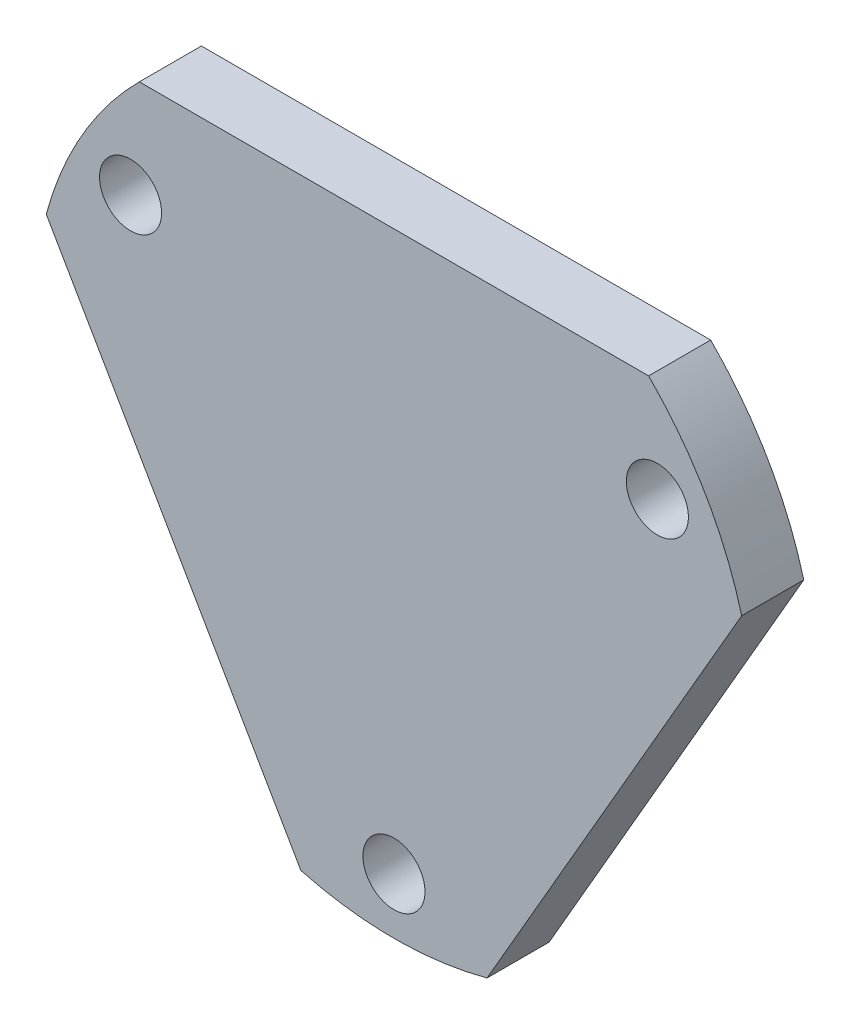
ISO-10303-21;
HEADER;
FILE_DESCRIPTION(('STEP AP214'),'2;1');
FILE_NAME('part.step','',(''),(''),'','','');
FILE_SCHEMA(('AUTOMOTIVE_DESIGN { 1 0 10303 214 1 1 1 1 }'));
ENDSEC;
DATA;
#1=APPLICATION_CONTEXT('core data for automotive mechanical design processes');
#2=APPLICATION_PROTOCOL_DEFINITION('international standard','automotive_design',2000,#1);
#3=PRODUCT_CONTEXT('',#1,'mechanical');
#4=PRODUCT('Part','Part','',(#3));
#5=PRODUCT_RELATED_PRODUCT_CATEGORY('part','',(#4));
#6=PRODUCT_DEFINITION_FORMATION('','',#4);
#7=PRODUCT_DEFINITION_CONTEXT('part definition',#1,'design');
#8=PRODUCT_DEFINITION('design','',#6,#7);
#9=PRODUCT_DEFINITION_SHAPE('','',#8);
#10=(LENGTH_UNIT() NAMED_UNIT(*) SI_UNIT(.MILLI.,.METRE.));
#11=(NAMED_UNIT(*) PLANE_ANGLE_UNIT() SI_UNIT($,.RADIAN.));
#12=(NAMED_UNIT(*) SI_UNIT($,.STERADIAN.) SOLID_ANGLE_UNIT());
#13=UNCERTAINTY_MEASURE_WITH_UNIT(LENGTH_MEASURE(1.E-05),#10,'distance_accuracy_value','');
#14=(GEOMETRIC_REPRESENTATION_CONTEXT(3) GLOBAL_UNCERTAINTY_ASSIGNED_CONTEXT((#13)) GLOBAL_UNIT_ASSIGNED_CONTEXT((#10,
#11,#12)) REPRESENTATION_CONTEXT('',''));
#15=CARTESIAN_POINT('',(0.,0.,0.));
#16=DIRECTION('',(0.,0.,1.));
#17=DIRECTION('',(1.,0.,0.));
#18=AXIS2_PLACEMENT_3D('',#15,#16,#17);
#19=CARTESIAN_POINT('',(0.,0.,-2.5));
#20=DIRECTION('',(0.,0.,1.));
#21=DIRECTION('',(1.,0.,0.));
#22=AXIS2_PLACEMENT_3D('',#19,#20,#21);
#23=PLANE('',#22);
#24=CARTESIAN_POINT('',(0.,0.,-2.5));
#25=DIRECTION('',(0.,0.,-1.));
#26=DIRECTION('',(1.,0.,0.));
#27=AXIS2_PLACEMENT_3D('',#24,#25,#26);
#28=CIRCLE('',#27,14.5);
#29=CARTESIAN_POINT('',(10.256095748383,10.25,-2.5));
#30=VERTEX_POINT('',#29);
#31=CARTESIAN_POINT('',(14.004808262982,3.75703946174525,-2.5));
#32=VERTEX_POINT('',#31);
#33=EDGE_CURVE('E131',#30,#32,#28,.T.);
#34=ORIENTED_EDGE('',*,*,#33,.T.);
#35=DIRECTION('',(-0.5,-0.866025403784438,0.));
#36=VECTOR('',#35,1.);
#37=CARTESIAN_POINT('',(3.748712514599,-14.0070394617453,-2.5));
#38=LINE('',#37,#36);
#39=CARTESIAN_POINT('',(3.74871251459899,-14.0070394617453,-2.5));
#40=VERTEX_POINT('',#39);
#41=EDGE_CURVE('E89',#32,#40,#38,.T.);
#42=ORIENTED_EDGE('',*,*,#41,.T.);
#43=CARTESIAN_POINT('',(0.,0.,-2.5));
#44=DIRECTION('',(0.,0.,-1.));
#45=DIRECTION('',(1.,0.,0.));
#46=AXIS2_PLACEMENT_3D('',#43,#44,#45);
#47=CIRCLE('',#46,14.5);
#48=CARTESIAN_POINT('',(-3.748712514599,-14.0070394617453,-2.5));
#49=VERTEX_POINT('',#48);
#50=EDGE_CURVE('E102',#40,#49,#47,.T.);
#51=ORIENTED_EDGE('',*,*,#50,.T.);
#52=DIRECTION('',(-0.5,0.866025403784439,0.));
#53=VECTOR('',#52,1.);
#54=CARTESIAN_POINT('',(-14.004808262982,3.75703946174526,-2.5));
#55=LINE('',#54,#53);
#56=CARTESIAN_POINT('',(-14.004808262982,3.75703946174525,-2.5));
#57=VERTEX_POINT('',#56);
#58=EDGE_CURVE('E96',#49,#57,#55,.T.);
#59=ORIENTED_EDGE('',*,*,#58,.T.);
#60=CARTESIAN_POINT('',(0.,0.,-2.5));
#61=DIRECTION('',(0.,0.,-1.));
#62=DIRECTION('',(1.,0.,0.));
#63=AXIS2_PLACEMENT_3D('',#60,#61,#62);
#64=CIRCLE('',#63,14.5);
#65=CARTESIAN_POINT('',(-10.256095748383,10.25,-2.5));
#66=VERTEX_POINT('',#65);
#67=EDGE_CURVE('E100',#57,#66,#64,.T.);
#68=ORIENTED_EDGE('',*,*,#67,.T.);
#69=DIRECTION('',(1.,0.,0.));
#70=VECTOR('',#69,1.);
#71=CARTESIAN_POINT('',(-10.256095748383,10.25,-2.5));
#72=LINE('',#71,#70);
#73=EDGE_CURVE('E52',#66,#30,#72,.T.);
#74=ORIENTED_EDGE('',*,*,#73,.T.);
#75=EDGE_LOOP('',(#34,#42,#51,#59,#68,#74));
#76=FACE_BOUND('',#75,.T.);
#77=CARTESIAN_POINT('',(0.,-12.25,-2.5));
#78=DIRECTION('',(0.,0.,-1.));
#79=DIRECTION('',(-1.,0.,0.));
#80=AXIS2_PLACEMENT_3D('',#77,#78,#79);
#81=CIRCLE('',#80,1.25);
#82=CARTESIAN_POINT('',(-1.25,-12.25,-2.5));
#83=VERTEX_POINT('',#82);
#84=EDGE_CURVE('E124',#83,#83,#81,.T.);
#85=ORIENTED_EDGE('',*,*,#84,.F.);
#86=EDGE_LOOP('',(#85));
#87=FACE_BOUND('',#86,.T.);
#88=CARTESIAN_POINT('',(10.6088111963594,6.125,-2.5));
#89=DIRECTION('',(0.,0.,-1.));
#90=DIRECTION('',(-1.,0.,0.));
#91=AXIS2_PLACEMENT_3D('',#88,#89,#90);
#92=CIRCLE('',#91,1.25);
#93=CARTESIAN_POINT('',(9.35881119635938,6.125,-2.5));
#94=VERTEX_POINT('',#93);
#95=EDGE_CURVE('E185',#94,#94,#92,.T.);
#96=ORIENTED_EDGE('',*,*,#95,.F.);
#97=EDGE_LOOP('',(#96));
#98=FACE_BOUND('',#97,.T.);
#99=CARTESIAN_POINT('',(-10.6088111963594,6.12500000000001,-2.5));
#100=DIRECTION('',(0.,0.,-1.));
#101=DIRECTION('',(-1.,0.,0.));
#102=AXIS2_PLACEMENT_3D('',#99,#100,#101);
#103=CIRCLE('',#102,1.25);
#104=CARTESIAN_POINT('',(-11.8588111963594,6.12500000000001,-2.5));
#105=VERTEX_POINT('',#104);
#106=EDGE_CURVE('E176',#105,#105,#103,.T.);
#107=ORIENTED_EDGE('',*,*,#106,.F.);
#108=EDGE_LOOP('',(#107));
#109=FACE_BOUND('',#108,.T.);
#110=ADVANCED_FACE('F35',(#76,#87,#98,#109),#23,.F.);
#111=CARTESIAN_POINT('',(0.,0.,0.));
#112=DIRECTION('',(0.,0.,1.));
#113=DIRECTION('',(1.,0.,0.));
#114=AXIS2_PLACEMENT_3D('',#111,#112,#113);
#115=PLANE('',#114);
#116=CARTESIAN_POINT('',(10.6088111963594,6.125,0.));
#117=DIRECTION('',(0.,0.,-1.));
#118=DIRECTION('',(-1.,0.,0.));
#119=AXIS2_PLACEMENT_3D('',#116,#117,#118);
#120=CIRCLE('',#119,1.25);
#121=CARTESIAN_POINT('',(9.35881119635938,6.125,0.));
#122=VERTEX_POINT('',#121);
#123=EDGE_CURVE('E182',#122,#122,#120,.T.);
#124=ORIENTED_EDGE('',*,*,#123,.T.);
#125=EDGE_LOOP('',(#124));
#126=FACE_BOUND('',#125,.T.);
#127=CARTESIAN_POINT('',(0.,0.,0.));
#128=DIRECTION('',(0.,0.,-1.));
#129=DIRECTION('',(1.,0.,0.));
#130=AXIS2_PLACEMENT_3D('',#127,#128,#129);
#131=CIRCLE('',#130,14.5);
#132=CARTESIAN_POINT('',(10.256095748383,10.25,0.));
#133=VERTEX_POINT('',#132);
#134=CARTESIAN_POINT('',(14.004808262982,3.75703946174525,0.));
#135=VERTEX_POINT('',#134);
#136=EDGE_CURVE('E120',#133,#135,#131,.T.);
#137=ORIENTED_EDGE('',*,*,#136,.F.);
#138=DIRECTION('',(1.,0.,0.));
#139=VECTOR('',#138,1.);
#140=CARTESIAN_POINT('',(-10.256095748383,10.25,0.));
#141=LINE('',#140,#139);
#142=CARTESIAN_POINT('',(-10.256095748383,10.25,0.));
#143=VERTEX_POINT('',#142);
#144=EDGE_CURVE('E81',#143,#133,#141,.T.);
#145=ORIENTED_EDGE('',*,*,#144,.F.);
#146=CARTESIAN_POINT('',(0.,0.,0.));
#147=DIRECTION('',(0.,0.,-1.));
#148=DIRECTION('',(1.,0.,0.));
#149=AXIS2_PLACEMENT_3D('',#146,#147,#148);
#150=CIRCLE('',#149,14.5);
#151=CARTESIAN_POINT('',(-14.004808262982,3.75703946174525,0.));
#152=VERTEX_POINT('',#151);
#153=EDGE_CURVE('E75',#152,#143,#150,.T.);
#154=ORIENTED_EDGE('',*,*,#153,.F.);
#155=DIRECTION('',(-0.5,0.866025403784439,0.));
#156=VECTOR('',#155,1.);
#157=CARTESIAN_POINT('',(-14.004808262982,3.75703946174526,0.));
#158=LINE('',#157,#156);
#159=CARTESIAN_POINT('',(-3.748712514599,-14.0070394617453,0.));
#160=VERTEX_POINT('',#159);
#161=EDGE_CURVE('E110',#160,#152,#158,.T.);
#162=ORIENTED_EDGE('',*,*,#161,.F.);
#163=CARTESIAN_POINT('',(0.,0.,0.));
#164=DIRECTION('',(0.,0.,-1.));
#165=DIRECTION('',(1.,0.,0.));
#166=AXIS2_PLACEMENT_3D('',#163,#164,#165);
#167=CIRCLE('',#166,14.5);
#168=CARTESIAN_POINT('',(3.74871251459899,-14.0070394617453,0.));
#169=VERTEX_POINT('',#168);
#170=EDGE_CURVE('E126',#169,#160,#167,.T.);
#171=ORIENTED_EDGE('',*,*,#170,.F.);
#172=DIRECTION('',(-0.5,-0.866025403784438,0.));
#173=VECTOR('',#172,1.);
#174=CARTESIAN_POINT('',(3.748712514599,-14.0070394617453,0.));
#175=LINE('',#174,#173);
#176=EDGE_CURVE('E123',#135,#169,#175,.T.);
#177=ORIENTED_EDGE('',*,*,#176,.F.);
#178=EDGE_LOOP('',(#137,#145,#154,#162,#171,#177));
#179=FACE_BOUND('',#178,.T.);
#180=CARTESIAN_POINT('',(0.,-12.25,0.));
#181=DIRECTION('',(0.,0.,-1.));
#182=DIRECTION('',(-1.,0.,0.));
#183=AXIS2_PLACEMENT_3D('',#180,#181,#182);
#184=CIRCLE('',#183,1.25);
#185=CARTESIAN_POINT('',(-1.25,-12.25,0.));
#186=VERTEX_POINT('',#185);
#187=EDGE_CURVE('E188',#186,#186,#184,.T.);
#188=ORIENTED_EDGE('',*,*,#187,.T.);
#189=EDGE_LOOP('',(#188));
#190=FACE_BOUND('',#189,.T.);
#191=CARTESIAN_POINT('',(-10.6088111963594,6.12500000000001,0.));
#192=DIRECTION('',(0.,0.,-1.));
#193=DIRECTION('',(-1.,0.,0.));
#194=AXIS2_PLACEMENT_3D('',#191,#192,#193);
#195=CIRCLE('',#194,1.25);
#196=CARTESIAN_POINT('',(-11.8588111963594,6.12500000000001,0.));
#197=VERTEX_POINT('',#196);
#198=EDGE_CURVE('E179',#197,#197,#195,.T.);
#199=ORIENTED_EDGE('',*,*,#198,.T.);
#200=EDGE_LOOP('',(#199));
#201=FACE_BOUND('',#200,.T.);
#202=ADVANCED_FACE('F140',(#126,#179,#190,#201),#115,.T.);
#203=CARTESIAN_POINT('',(0.,0.,-2.5));
#204=DIRECTION('',(0.,0.,1.));
#205=DIRECTION('',(1.,0.,0.));
#206=AXIS2_PLACEMENT_3D('',#203,#204,#205);
#207=CYLINDRICAL_SURFACE('',#206,14.5);
#208=ORIENTED_EDGE('',*,*,#136,.T.);
#209=DIRECTION('',(0.,0.,1.));
#210=VECTOR('',#209,1.);
#211=CARTESIAN_POINT('',(14.004808262982,3.75703946174525,-2.5));
#212=LINE('',#211,#210);
#213=EDGE_CURVE('E11',#32,#135,#212,.T.);
#214=ORIENTED_EDGE('',*,*,#213,.F.);
#215=ORIENTED_EDGE('',*,*,#33,.F.);
#216=DIRECTION('',(0.,0.,1.));
#217=VECTOR('',#216,1.);
#218=CARTESIAN_POINT('',(10.256095748383,10.25,-2.5));
#219=LINE('',#218,#217);
#220=EDGE_CURVE('E116',#30,#133,#219,.T.);
#221=ORIENTED_EDGE('',*,*,#220,.T.);
#222=EDGE_LOOP('',(#208,#214,#215,#221));
#223=FACE_BOUND('',#222,.T.);
#224=ADVANCED_FACE('F37',(#223),#207,.T.);
#225=CARTESIAN_POINT('',(3.748712514599,-14.0070394617453,-2.5));
#226=DIRECTION('',(-0.866025403784439,0.5,0.));
#227=DIRECTION('',(-0.5,-0.866025403784439,0.));
#228=AXIS2_PLACEMENT_3D('',#225,#226,#227);
#229=PLANE('',#228);
#230=ORIENTED_EDGE('',*,*,#176,.T.);
#231=DIRECTION('',(0.,0.,1.));
#232=VECTOR('',#231,1.);
#233=CARTESIAN_POINT('',(3.74871251459899,-14.0070394617453,-2.5));
#234=LINE('',#233,#232);
#235=EDGE_CURVE('E44',#40,#169,#234,.T.);
#236=ORIENTED_EDGE('',*,*,#235,.F.);
#237=ORIENTED_EDGE('',*,*,#41,.F.);
#238=ORIENTED_EDGE('',*,*,#213,.T.);
#239=EDGE_LOOP('',(#230,#236,#237,#238));
#240=FACE_BOUND('',#239,.T.);
#241=ADVANCED_FACE('F239',(#240),#229,.F.);
#242=CARTESIAN_POINT('',(0.,0.,-2.5));
#243=DIRECTION('',(0.,0.,1.));
#244=DIRECTION('',(1.,0.,0.));
#245=AXIS2_PLACEMENT_3D('',#242,#243,#244);
#246=CYLINDRICAL_SURFACE('',#245,14.5);
#247=ORIENTED_EDGE('',*,*,#170,.T.);
#248=DIRECTION('',(0.,0.,1.));
#249=VECTOR('',#248,1.);
#250=CARTESIAN_POINT('',(-3.748712514599,-14.0070394617453,-2.5));
#251=LINE('',#250,#249);
#252=EDGE_CURVE('E111',#49,#160,#251,.T.);
#253=ORIENTED_EDGE('',*,*,#252,.F.);
#254=ORIENTED_EDGE('',*,*,#50,.F.);
#255=ORIENTED_EDGE('',*,*,#235,.T.);
#256=EDGE_LOOP('',(#247,#253,#254,#255));
#257=FACE_BOUND('',#256,.T.);
#258=ADVANCED_FACE('F137',(#257),#246,.T.);
#259=CARTESIAN_POINT('',(-14.004808262982,3.75703946174526,-2.5));
#260=DIRECTION('',(0.866025403784439,0.5,0.));
#261=DIRECTION('',(-0.5,0.866025403784439,0.));
#262=AXIS2_PLACEMENT_3D('',#259,#260,#261);
#263=PLANE('',#262);
#264=ORIENTED_EDGE('',*,*,#161,.T.);
#265=DIRECTION('',(0.,0.,1.));
#266=VECTOR('',#265,1.);
#267=CARTESIAN_POINT('',(-14.004808262982,3.75703946174525,-2.5));
#268=LINE('',#267,#266);
#269=EDGE_CURVE('E107',#57,#152,#268,.T.);
#270=ORIENTED_EDGE('',*,*,#269,.F.);
#271=ORIENTED_EDGE('',*,*,#58,.F.);
#272=ORIENTED_EDGE('',*,*,#252,.T.);
#273=EDGE_LOOP('',(#264,#270,#271,#272));
#274=FACE_BOUND('',#273,.T.);
#275=ADVANCED_FACE('F108',(#274),#263,.F.);
#276=CARTESIAN_POINT('',(0.,0.,-2.5));
#277=DIRECTION('',(0.,0.,1.));
#278=DIRECTION('',(1.,0.,0.));
#279=AXIS2_PLACEMENT_3D('',#276,#277,#278);
#280=CYLINDRICAL_SURFACE('',#279,14.5);
#281=ORIENTED_EDGE('',*,*,#153,.T.);
#282=DIRECTION('',(0.,0.,1.));
#283=VECTOR('',#282,1.);
#284=CARTESIAN_POINT('',(-10.256095748383,10.25,-2.5));
#285=LINE('',#284,#283);
#286=EDGE_CURVE('E112',#66,#143,#285,.T.);
#287=ORIENTED_EDGE('',*,*,#286,.F.);
#288=ORIENTED_EDGE('',*,*,#67,.F.);
#289=ORIENTED_EDGE('',*,*,#269,.T.);
#290=EDGE_LOOP('',(#281,#287,#288,#289));
#291=FACE_BOUND('',#290,.T.);
#292=ADVANCED_FACE('F114',(#291),#280,.T.);
#293=CARTESIAN_POINT('',(-10.256095748383,10.25,-2.5));
#294=DIRECTION('',(0.,-1.,0.));
#295=DIRECTION('',(0.,0.,-1.));
#296=AXIS2_PLACEMENT_3D('',#293,#294,#295);
#297=PLANE('',#296);
#298=ORIENTED_EDGE('',*,*,#144,.T.);
#299=ORIENTED_EDGE('',*,*,#220,.F.);
#300=ORIENTED_EDGE('',*,*,#73,.F.);
#301=ORIENTED_EDGE('',*,*,#286,.T.);
#302=EDGE_LOOP('',(#298,#299,#300,#301));
#303=FACE_BOUND('',#302,.T.);
#304=ADVANCED_FACE('F145',(#303),#297,.F.);
#305=CARTESIAN_POINT('',(0.,-12.25,-2.5));
#306=DIRECTION('',(0.,0.,1.));
#307=DIRECTION('',(1.,0.,0.));
#308=AXIS2_PLACEMENT_3D('',#305,#306,#307);
#309=CYLINDRICAL_SURFACE('',#308,1.25);
#310=ORIENTED_EDGE('',*,*,#84,.T.);
#311=EDGE_LOOP('',(#310));
#312=FACE_BOUND('',#311,.T.);
#313=ORIENTED_EDGE('',*,*,#187,.F.);
#314=EDGE_LOOP('',(#313));
#315=FACE_BOUND('',#314,.T.);
#316=ADVANCED_FACE('F147',(#312,#315),#309,.F.);
#317=CARTESIAN_POINT('',(10.6088111963594,6.125,-2.5));
#318=DIRECTION('',(0.,0.,1.));
#319=DIRECTION('',(1.,0.,0.));
#320=AXIS2_PLACEMENT_3D('',#317,#318,#319);
#321=CYLINDRICAL_SURFACE('',#320,1.25);
#322=ORIENTED_EDGE('',*,*,#95,.T.);
#323=EDGE_LOOP('',(#322));
#324=FACE_BOUND('',#323,.T.);
#325=ORIENTED_EDGE('',*,*,#123,.F.);
#326=EDGE_LOOP('',(#325));
#327=FACE_BOUND('',#326,.T.);
#328=ADVANCED_FACE('F153',(#324,#327),#321,.F.);
#329=CARTESIAN_POINT('',(-10.6088111963594,6.12500000000001,-2.5));
#330=DIRECTION('',(0.,0.,1.));
#331=DIRECTION('',(1.,0.,0.));
#332=AXIS2_PLACEMENT_3D('',#329,#330,#331);
#333=CYLINDRICAL_SURFACE('',#332,1.25);
#334=ORIENTED_EDGE('',*,*,#106,.T.);
#335=EDGE_LOOP('',(#334));
#336=FACE_BOUND('',#335,.T.);
#337=ORIENTED_EDGE('',*,*,#198,.F.);
#338=EDGE_LOOP('',(#337));
#339=FACE_BOUND('',#338,.T.);
#340=ADVANCED_FACE('F167',(#336,#339),#333,.F.);
#341=CLOSED_SHELL('',(#110,#202,#224,#241,#258,#275,#292,#304,#316,#328,#340));
#342=MANIFOLD_SOLID_BREP('B2',#341);
#343=ADVANCED_BREP_SHAPE_REPRESENTATION('',(#18,#342),#14);
#344=SHAPE_DEFINITION_REPRESENTATION(#9,#343);
ENDSEC;
END-ISO-10303-21;
